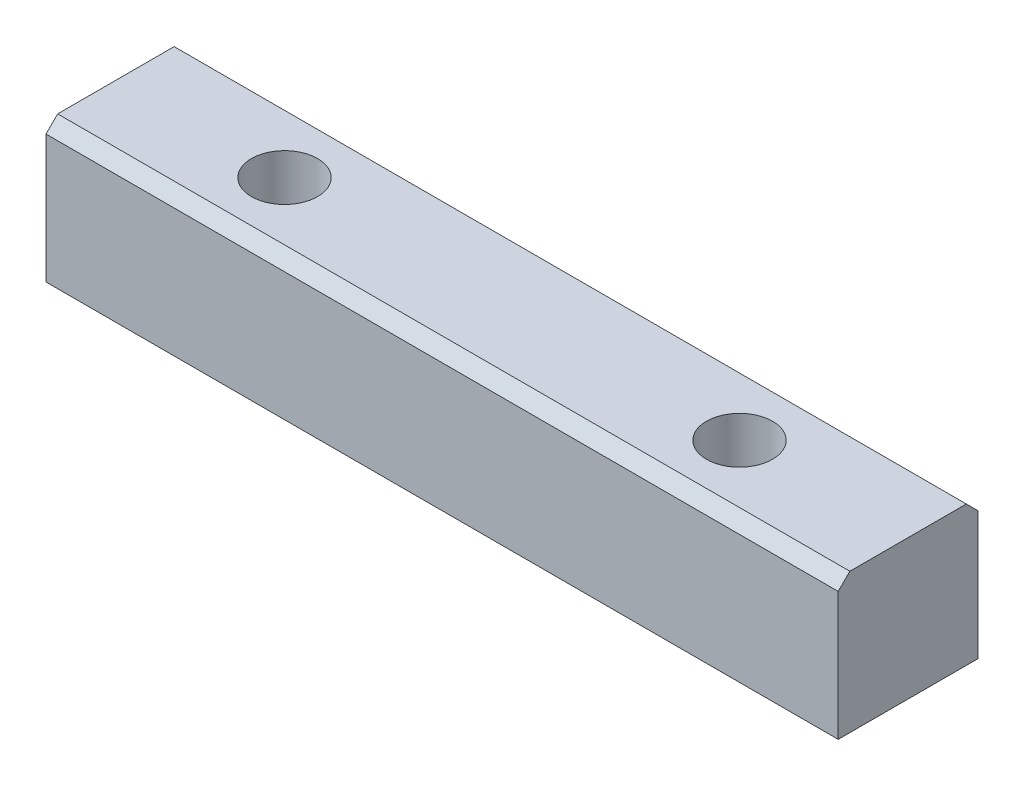
ISO-10303-21;
HEADER;
FILE_DESCRIPTION(('STEP AP214'),'2;1');
FILE_NAME('part.step','',(''),(''),'','','');
FILE_SCHEMA(('AUTOMOTIVE_DESIGN { 1 0 10303 214 1 1 1 1 }'));
ENDSEC;
DATA;
#1=APPLICATION_CONTEXT('core data for automotive mechanical design processes');
#2=APPLICATION_PROTOCOL_DEFINITION('international standard','automotive_design',2000,#1);
#3=PRODUCT_CONTEXT('',#1,'mechanical');
#4=PRODUCT('Part','Part','',(#3));
#5=PRODUCT_RELATED_PRODUCT_CATEGORY('part','',(#4));
#6=PRODUCT_DEFINITION_FORMATION('','',#4);
#7=PRODUCT_DEFINITION_CONTEXT('part definition',#1,'design');
#8=PRODUCT_DEFINITION('design','',#6,#7);
#9=PRODUCT_DEFINITION_SHAPE('','',#8);
#10=(LENGTH_UNIT() NAMED_UNIT(*) SI_UNIT(.MILLI.,.METRE.));
#11=(NAMED_UNIT(*) PLANE_ANGLE_UNIT() SI_UNIT($,.RADIAN.));
#12=(NAMED_UNIT(*) SI_UNIT($,.STERADIAN.) SOLID_ANGLE_UNIT());
#13=UNCERTAINTY_MEASURE_WITH_UNIT(LENGTH_MEASURE(1.E-05),#10,'distance_accuracy_value','');
#14=(GEOMETRIC_REPRESENTATION_CONTEXT(3) GLOBAL_UNCERTAINTY_ASSIGNED_CONTEXT((#13)) GLOBAL_UNIT_ASSIGNED_CONTEXT((#10,
#11,#12)) REPRESENTATION_CONTEXT('',''));
#15=CARTESIAN_POINT('',(0.,0.,0.));
#16=DIRECTION('',(0.,0.,1.));
#17=DIRECTION('',(1.,0.,0.));
#18=AXIS2_PLACEMENT_3D('',#15,#16,#17);
#19=CARTESIAN_POINT('',(53.975,9.525,9.525));
#20=DIRECTION('',(0.,0.,-1.));
#21=DIRECTION('',(0.,1.,0.));
#22=AXIS2_PLACEMENT_3D('',#19,#20,#21);
#23=PLANE('',#22);
#24=DIRECTION('',(0.,-1.,0.));
#25=VECTOR('',#24,1.);
#26=CARTESIAN_POINT('',(53.975,9.525,9.525));
#27=LINE('',#26,#25);
#28=CARTESIAN_POINT('',(53.975,7.93749999999999,9.525));
#29=VERTEX_POINT('',#28);
#30=CARTESIAN_POINT('',(53.975,-9.525,9.525));
#31=VERTEX_POINT('',#30);
#32=EDGE_CURVE('E87',#29,#31,#27,.T.);
#33=ORIENTED_EDGE('',*,*,#32,.F.);
#34=DIRECTION('',(-1.,0.,0.));
#35=VECTOR('',#34,1.);
#36=CARTESIAN_POINT('',(53.975,7.9375,9.525));
#37=LINE('',#36,#35);
#38=CARTESIAN_POINT('',(-53.975,7.9375,9.525));
#39=VERTEX_POINT('',#38);
#40=EDGE_CURVE('E11',#29,#39,#37,.T.);
#41=ORIENTED_EDGE('',*,*,#40,.T.);
#42=DIRECTION('',(0.,-1.,0.));
#43=VECTOR('',#42,1.);
#44=CARTESIAN_POINT('',(-53.975,9.525,9.525));
#45=LINE('',#44,#43);
#46=CARTESIAN_POINT('',(-53.975,-9.525,9.525));
#47=VERTEX_POINT('',#46);
#48=EDGE_CURVE('E106',#39,#47,#45,.T.);
#49=ORIENTED_EDGE('',*,*,#48,.T.);
#50=DIRECTION('',(-1.,0.,0.));
#51=VECTOR('',#50,1.);
#52=CARTESIAN_POINT('',(53.975,-9.525,9.525));
#53=LINE('',#52,#51);
#54=EDGE_CURVE('E100',#31,#47,#53,.T.);
#55=ORIENTED_EDGE('',*,*,#54,.F.);
#56=EDGE_LOOP('',(#33,#41,#49,#55));
#57=FACE_BOUND('',#56,.T.);
#58=ADVANCED_FACE('F34',(#57),#23,.F.);
#59=CARTESIAN_POINT('',(53.975,-9.525,9.525));
#60=DIRECTION('',(0.,1.,0.));
#61=DIRECTION('',(0.,0.,1.));
#62=AXIS2_PLACEMENT_3D('',#59,#60,#61);
#63=PLANE('',#62);
#64=CARTESIAN_POINT('',(-31.,-9.525,0.));
#65=DIRECTION('',(0.,1.,0.));
#66=DIRECTION('',(0.,0.,1.));
#67=AXIS2_PLACEMENT_3D('',#64,#65,#66);
#68=CIRCLE('',#67,4.5);
#69=CARTESIAN_POINT('',(-31.,-9.525,4.5));
#70=VERTEX_POINT('',#69);
#71=EDGE_CURVE('E151',#70,#70,#68,.T.);
#72=ORIENTED_EDGE('',*,*,#71,.T.);
#73=EDGE_LOOP('',(#72));
#74=FACE_BOUND('',#73,.T.);
#75=CARTESIAN_POINT('',(31.,-9.525,0.));
#76=DIRECTION('',(0.,1.,0.));
#77=DIRECTION('',(0.,0.,1.));
#78=AXIS2_PLACEMENT_3D('',#75,#76,#77);
#79=CIRCLE('',#78,4.5);
#80=CARTESIAN_POINT('',(31.,-9.525,4.5));
#81=VERTEX_POINT('',#80);
#82=EDGE_CURVE('E143',#81,#81,#79,.T.);
#83=ORIENTED_EDGE('',*,*,#82,.T.);
#84=EDGE_LOOP('',(#83));
#85=FACE_BOUND('',#84,.T.);
#86=DIRECTION('',(0.,0.,-1.));
#87=VECTOR('',#86,1.);
#88=CARTESIAN_POINT('',(-53.975,-9.525,9.525));
#89=LINE('',#88,#87);
#90=CARTESIAN_POINT('',(-53.975,-9.525,-9.525));
#91=VERTEX_POINT('',#90);
#92=EDGE_CURVE('E139',#47,#91,#89,.T.);
#93=ORIENTED_EDGE('',*,*,#92,.T.);
#94=DIRECTION('',(-1.,0.,0.));
#95=VECTOR('',#94,1.);
#96=CARTESIAN_POINT('',(53.975,-9.525,-9.525));
#97=LINE('',#96,#95);
#98=CARTESIAN_POINT('',(53.975,-9.525,-9.525));
#99=VERTEX_POINT('',#98);
#100=EDGE_CURVE('E102',#99,#91,#97,.T.);
#101=ORIENTED_EDGE('',*,*,#100,.F.);
#102=DIRECTION('',(0.,0.,-1.));
#103=VECTOR('',#102,1.);
#104=CARTESIAN_POINT('',(53.975,-9.525,9.525));
#105=LINE('',#104,#103);
#106=EDGE_CURVE('E90',#31,#99,#105,.T.);
#107=ORIENTED_EDGE('',*,*,#106,.F.);
#108=ORIENTED_EDGE('',*,*,#54,.T.);
#109=EDGE_LOOP('',(#93,#101,#107,#108));
#110=FACE_BOUND('',#109,.T.);
#111=ADVANCED_FACE('F99',(#74,#85,#110),#63,.F.);
#112=CARTESIAN_POINT('',(53.975,9.525,-9.525));
#113=DIRECTION('',(0.,0.,1.));
#114=DIRECTION('',(1.,0.,0.));
#115=AXIS2_PLACEMENT_3D('',#112,#113,#114);
#116=PLANE('',#115);
#117=DIRECTION('',(0.,1.,0.));
#118=VECTOR('',#117,1.);
#119=CARTESIAN_POINT('',(-53.975,9.525,-9.525));
#120=LINE('',#119,#118);
#121=CARTESIAN_POINT('',(-53.975,7.93749999999999,-9.525));
#122=VERTEX_POINT('',#121);
#123=EDGE_CURVE('E137',#91,#122,#120,.T.);
#124=ORIENTED_EDGE('',*,*,#123,.T.);
#125=DIRECTION('',(1.,0.,0.));
#126=VECTOR('',#125,1.);
#127=CARTESIAN_POINT('',(53.975,7.93749999999999,-9.525));
#128=LINE('',#127,#126);
#129=CARTESIAN_POINT('',(53.975,7.93749999999999,-9.525));
#130=VERTEX_POINT('',#129);
#131=EDGE_CURVE('E57',#122,#130,#128,.T.);
#132=ORIENTED_EDGE('',*,*,#131,.T.);
#133=DIRECTION('',(0.,1.,0.));
#134=VECTOR('',#133,1.);
#135=CARTESIAN_POINT('',(53.975,9.525,-9.525));
#136=LINE('',#135,#134);
#137=EDGE_CURVE('E103',#99,#130,#136,.T.);
#138=ORIENTED_EDGE('',*,*,#137,.F.);
#139=ORIENTED_EDGE('',*,*,#100,.T.);
#140=EDGE_LOOP('',(#124,#132,#138,#139));
#141=FACE_BOUND('',#140,.T.);
#142=ADVANCED_FACE('F138',(#141),#116,.F.);
#143=CARTESIAN_POINT('',(53.975,9.525,9.525));
#144=DIRECTION('',(0.,-1.,0.));
#145=DIRECTION('',(0.,0.,-1.));
#146=AXIS2_PLACEMENT_3D('',#143,#144,#145);
#147=PLANE('',#146);
#148=CARTESIAN_POINT('',(-31.,9.525,0.));
#149=DIRECTION('',(0.,1.,0.));
#150=DIRECTION('',(0.,0.,1.));
#151=AXIS2_PLACEMENT_3D('',#148,#149,#150);
#152=CIRCLE('',#151,4.5);
#153=CARTESIAN_POINT('',(-31.,9.525,4.5));
#154=VERTEX_POINT('',#153);
#155=EDGE_CURVE('E154',#154,#154,#152,.T.);
#156=ORIENTED_EDGE('',*,*,#155,.F.);
#157=EDGE_LOOP('',(#156));
#158=FACE_BOUND('',#157,.T.);
#159=CARTESIAN_POINT('',(31.,9.525,0.));
#160=DIRECTION('',(0.,1.,0.));
#161=DIRECTION('',(0.,0.,1.));
#162=AXIS2_PLACEMENT_3D('',#159,#160,#161);
#163=CIRCLE('',#162,4.5);
#164=CARTESIAN_POINT('',(31.,9.525,4.5));
#165=VERTEX_POINT('',#164);
#166=EDGE_CURVE('E148',#165,#165,#163,.T.);
#167=ORIENTED_EDGE('',*,*,#166,.F.);
#168=EDGE_LOOP('',(#167));
#169=FACE_BOUND('',#168,.T.);
#170=DIRECTION('',(0.,0.,1.));
#171=VECTOR('',#170,1.);
#172=CARTESIAN_POINT('',(53.975,9.525,9.525));
#173=LINE('',#172,#171);
#174=CARTESIAN_POINT('',(53.975,9.525,-7.93749999999999));
#175=VERTEX_POINT('',#174);
#176=CARTESIAN_POINT('',(53.975,9.525,7.93749999999999));
#177=VERTEX_POINT('',#176);
#178=EDGE_CURVE('E112',#175,#177,#173,.T.);
#179=ORIENTED_EDGE('',*,*,#178,.F.);
#180=DIRECTION('',(-1.,0.,0.));
#181=VECTOR('',#180,1.);
#182=CARTESIAN_POINT('',(53.975,9.525,-7.93749999999999));
#183=LINE('',#182,#181);
#184=CARTESIAN_POINT('',(-53.975,9.525,-7.93749999999999));
#185=VERTEX_POINT('',#184);
#186=EDGE_CURVE('E110',#175,#185,#183,.T.);
#187=ORIENTED_EDGE('',*,*,#186,.T.);
#188=DIRECTION('',(0.,0.,1.));
#189=VECTOR('',#188,1.);
#190=CARTESIAN_POINT('',(-53.975,9.525,9.525));
#191=LINE('',#190,#189);
#192=CARTESIAN_POINT('',(-53.975,9.525,7.93749999999999));
#193=VERTEX_POINT('',#192);
#194=EDGE_CURVE('E95',#185,#193,#191,.T.);
#195=ORIENTED_EDGE('',*,*,#194,.T.);
#196=DIRECTION('',(1.,0.,0.));
#197=VECTOR('',#196,1.);
#198=CARTESIAN_POINT('',(53.975,9.525,7.93749999999999));
#199=LINE('',#198,#197);
#200=EDGE_CURVE('E108',#193,#177,#199,.T.);
#201=ORIENTED_EDGE('',*,*,#200,.T.);
#202=EDGE_LOOP('',(#179,#187,#195,#201));
#203=FACE_BOUND('',#202,.T.);
#204=ADVANCED_FACE('F128',(#158,#169,#203),#147,.F.);
#205=CARTESIAN_POINT('',(53.975,0.,0.));
#206=DIRECTION('',(1.,0.,0.));
#207=DIRECTION('',(0.,0.,-1.));
#208=AXIS2_PLACEMENT_3D('',#205,#206,#207);
#209=PLANE('',#208);
#210=ORIENTED_EDGE('',*,*,#137,.T.);
#211=DIRECTION('',(0.,-0.707106781186547,-0.707106781186548));
#212=VECTOR('',#211,1.);
#213=CARTESIAN_POINT('',(53.975,8.73125,-8.73124999999999));
#214=LINE('',#213,#212);
#215=EDGE_CURVE('E42',#130,#175,#214,.F.);
#216=ORIENTED_EDGE('',*,*,#215,.T.);
#217=ORIENTED_EDGE('',*,*,#178,.T.);
#218=DIRECTION('',(0.,0.707106781186548,-0.707106781186548));
#219=VECTOR('',#218,1.);
#220=CARTESIAN_POINT('',(53.975,8.73125,8.73125));
#221=LINE('',#220,#219);
#222=EDGE_CURVE('E49',#177,#29,#221,.F.);
#223=ORIENTED_EDGE('',*,*,#222,.T.);
#224=ORIENTED_EDGE('',*,*,#32,.T.);
#225=ORIENTED_EDGE('',*,*,#106,.T.);
#226=EDGE_LOOP('',(#210,#216,#217,#223,#224,#225));
#227=FACE_BOUND('',#226,.T.);
#228=ADVANCED_FACE('F89',(#227),#209,.T.);
#229=CARTESIAN_POINT('',(-53.975,0.,0.));
#230=DIRECTION('',(1.,0.,0.));
#231=DIRECTION('',(0.,0.,-1.));
#232=AXIS2_PLACEMENT_3D('',#229,#230,#231);
#233=PLANE('',#232);
#234=ORIENTED_EDGE('',*,*,#194,.F.);
#235=DIRECTION('',(0.,0.707106781186547,0.707106781186548));
#236=VECTOR('',#235,1.);
#237=CARTESIAN_POINT('',(-53.975,9.525,-7.93749999999999));
#238=LINE('',#237,#236);
#239=EDGE_CURVE('E120',#185,#122,#238,.F.);
#240=ORIENTED_EDGE('',*,*,#239,.T.);
#241=ORIENTED_EDGE('',*,*,#123,.F.);
#242=ORIENTED_EDGE('',*,*,#92,.F.);
#243=ORIENTED_EDGE('',*,*,#48,.F.);
#244=DIRECTION('',(0.,-0.707106781186548,0.707106781186548));
#245=VECTOR('',#244,1.);
#246=CARTESIAN_POINT('',(-53.975,7.9375,9.525));
#247=LINE('',#246,#245);
#248=EDGE_CURVE('E118',#39,#193,#247,.F.);
#249=ORIENTED_EDGE('',*,*,#248,.T.);
#250=EDGE_LOOP('',(#234,#240,#241,#242,#243,#249));
#251=FACE_BOUND('',#250,.T.);
#252=ADVANCED_FACE('F136',(#251),#233,.F.);
#253=CARTESIAN_POINT('',(31.,9.525,0.));
#254=DIRECTION('',(0.,1.,0.));
#255=DIRECTION('',(0.,0.,1.));
#256=AXIS2_PLACEMENT_3D('',#253,#254,#255);
#257=CYLINDRICAL_SURFACE('',#256,4.5);
#258=ORIENTED_EDGE('',*,*,#82,.F.);
#259=EDGE_LOOP('',(#258));
#260=FACE_BOUND('',#259,.T.);
#261=ORIENTED_EDGE('',*,*,#166,.T.);
#262=EDGE_LOOP('',(#261));
#263=FACE_BOUND('',#262,.T.);
#264=ADVANCED_FACE('F165',(#260,#263),#257,.F.);
#265=CARTESIAN_POINT('',(-31.,9.525,0.));
#266=DIRECTION('',(0.,1.,0.));
#267=DIRECTION('',(0.,0.,1.));
#268=AXIS2_PLACEMENT_3D('',#265,#266,#267);
#269=CYLINDRICAL_SURFACE('',#268,4.5);
#270=ORIENTED_EDGE('',*,*,#71,.F.);
#271=EDGE_LOOP('',(#270));
#272=FACE_BOUND('',#271,.T.);
#273=ORIENTED_EDGE('',*,*,#155,.T.);
#274=EDGE_LOOP('',(#273));
#275=FACE_BOUND('',#274,.T.);
#276=ADVANCED_FACE('F158',(#272,#275),#269,.F.);
#277=CARTESIAN_POINT('',(53.975,9.525,-7.93749999999999));
#278=DIRECTION('',(0.,-0.707106781186548,0.707106781186547));
#279=DIRECTION('',(-1.,0.,0.));
#280=AXIS2_PLACEMENT_3D('',#277,#278,#279);
#281=PLANE('',#280);
#282=ORIENTED_EDGE('',*,*,#215,.F.);
#283=ORIENTED_EDGE('',*,*,#131,.F.);
#284=ORIENTED_EDGE('',*,*,#239,.F.);
#285=ORIENTED_EDGE('',*,*,#186,.F.);
#286=EDGE_LOOP('',(#282,#283,#284,#285));
#287=FACE_BOUND('',#286,.T.);
#288=ADVANCED_FACE('F133',(#287),#281,.F.);
#289=CARTESIAN_POINT('',(53.975,7.9375,9.525));
#290=DIRECTION('',(0.,-0.707106781186548,-0.707106781186548));
#291=DIRECTION('',(-1.,0.,0.));
#292=AXIS2_PLACEMENT_3D('',#289,#290,#291);
#293=PLANE('',#292);
#294=ORIENTED_EDGE('',*,*,#222,.F.);
#295=ORIENTED_EDGE('',*,*,#200,.F.);
#296=ORIENTED_EDGE('',*,*,#248,.F.);
#297=ORIENTED_EDGE('',*,*,#40,.F.);
#298=EDGE_LOOP('',(#294,#295,#296,#297));
#299=FACE_BOUND('',#298,.T.);
#300=ADVANCED_FACE('F36',(#299),#293,.F.);
#301=CLOSED_SHELL('',(#58,#111,#142,#204,#228,#252,#264,#276,#288,#300));
#302=MANIFOLD_SOLID_BREP('B2',#301);
#303=ADVANCED_BREP_SHAPE_REPRESENTATION('',(#18,#302),#14);
#304=SHAPE_DEFINITION_REPRESENTATION(#9,#303);
ENDSEC;
END-ISO-10303-21;
